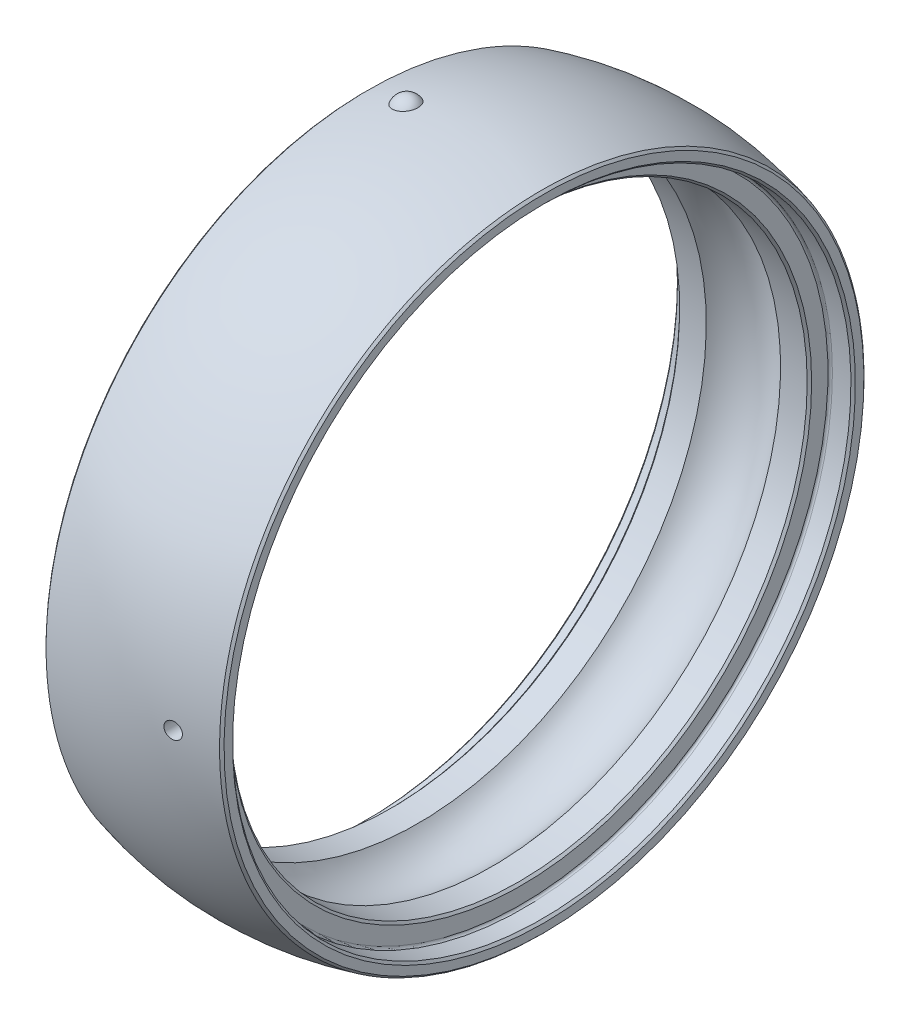
ISO-10303-21;
HEADER;
FILE_DESCRIPTION(('STEP AP214'),'2;1');
FILE_NAME('part.step','',(''),(''),'','','');
FILE_SCHEMA(('AUTOMOTIVE_DESIGN { 1 0 10303 214 1 1 1 1 }'));
ENDSEC;
DATA;
#1=APPLICATION_CONTEXT('core data for automotive mechanical design processes');
#2=APPLICATION_PROTOCOL_DEFINITION('international standard','automotive_design',2000,#1);
#3=PRODUCT_CONTEXT('',#1,'mechanical');
#4=PRODUCT('Part','Part','',(#3));
#5=PRODUCT_RELATED_PRODUCT_CATEGORY('part','',(#4));
#6=PRODUCT_DEFINITION_FORMATION('','',#4);
#7=PRODUCT_DEFINITION_CONTEXT('part definition',#1,'design');
#8=PRODUCT_DEFINITION('design','',#6,#7);
#9=PRODUCT_DEFINITION_SHAPE('','',#8);
#10=(LENGTH_UNIT() NAMED_UNIT(*) SI_UNIT(.MILLI.,.METRE.));
#11=(NAMED_UNIT(*) PLANE_ANGLE_UNIT() SI_UNIT($,.RADIAN.));
#12=(NAMED_UNIT(*) SI_UNIT($,.STERADIAN.) SOLID_ANGLE_UNIT());
#13=UNCERTAINTY_MEASURE_WITH_UNIT(LENGTH_MEASURE(1.E-05),#10,'distance_accuracy_value','');
#14=(GEOMETRIC_REPRESENTATION_CONTEXT(3) GLOBAL_UNCERTAINTY_ASSIGNED_CONTEXT((#13)) GLOBAL_UNIT_ASSIGNED_CONTEXT((#10,
#11,#12)) REPRESENTATION_CONTEXT('',''));
#15=CARTESIAN_POINT('',(0.,0.,0.));
#16=DIRECTION('',(0.,0.,1.));
#17=DIRECTION('',(1.,0.,0.));
#18=AXIS2_PLACEMENT_3D('',#15,#16,#17);
#19=CARTESIAN_POINT('',(-8.9,0.,40.3025));
#20=DIRECTION('',(-1.,0.,0.));
#21=DIRECTION('',(0.,0.,1.));
#22=AXIS2_PLACEMENT_3D('',#19,#20,#21);
#23=PLANE('',#22);
#24=CARTESIAN_POINT('',(-8.9,0.,0.));
#25=DIRECTION('',(-1.,0.,0.));
#26=DIRECTION('',(0.,0.,1.));
#27=AXIS2_PLACEMENT_3D('',#24,#25,#26);
#28=CIRCLE('',#27,39.2);
#29=CARTESIAN_POINT('',(-8.9,0.,39.2));
#30=VERTEX_POINT('',#29);
#31=EDGE_CURVE('E18',#30,#30,#28,.T.);
#32=ORIENTED_EDGE('',*,*,#31,.F.);
#33=EDGE_LOOP('',(#32));
#34=FACE_BOUND('',#33,.T.);
#35=CARTESIAN_POINT('',(-8.9,0.,0.));
#36=DIRECTION('',(1.,0.,0.));
#37=DIRECTION('',(0.,0.,1.));
#38=AXIS2_PLACEMENT_3D('',#35,#36,#37);
#39=CIRCLE('',#38,41.405);
#40=CARTESIAN_POINT('',(-8.9,0.,41.405));
#41=VERTEX_POINT('',#40);
#42=EDGE_CURVE('E157',#41,#41,#39,.T.);
#43=ORIENTED_EDGE('',*,*,#42,.F.);
#44=EDGE_LOOP('',(#43));
#45=FACE_BOUND('',#44,.T.);
#46=ADVANCED_FACE('F14',(#34,#45),#23,.T.);
#47=CARTESIAN_POINT('',(-8.6,0.,0.));
#48=DIRECTION('',(-1.,0.,0.));
#49=DIRECTION('',(0.,0.,1.));
#50=AXIS2_PLACEMENT_3D('',#47,#48,#49);
#51=CONICAL_SURFACE('',#50,38.9,0.785398163397443);
#52=ORIENTED_EDGE('',*,*,#31,.T.);
#53=EDGE_LOOP('',(#52));
#54=FACE_BOUND('',#53,.T.);
#55=CARTESIAN_POINT('',(-8.6,0.,0.));
#56=DIRECTION('',(-1.,0.,0.));
#57=DIRECTION('',(0.,0.,1.));
#58=AXIS2_PLACEMENT_3D('',#55,#56,#57);
#59=CIRCLE('',#58,38.8999999999693);
#60=CARTESIAN_POINT('',(-8.6,0.,38.8999999999693));
#61=VERTEX_POINT('',#60);
#62=EDGE_CURVE('E31',#61,#61,#59,.T.);
#63=ORIENTED_EDGE('',*,*,#62,.F.);
#64=EDGE_LOOP('',(#63));
#65=FACE_BOUND('',#64,.T.);
#66=ADVANCED_FACE('F180',(#54,#65),#51,.F.);
#67=CARTESIAN_POINT('',(-9.20000000000001,0.,0.));
#68=DIRECTION('',(1.,0.,0.));
#69=DIRECTION('',(0.,1.,0.));
#70=AXIS2_PLACEMENT_3D('',#67,#68,#69);
#71=TOROIDAL_SURFACE('',#70,41.405,0.300000000000004);
#72=ORIENTED_EDGE('',*,*,#42,.T.);
#73=EDGE_LOOP('',(#72));
#74=FACE_BOUND('',#73,.T.);
#75=CARTESIAN_POINT('',(-9.2,0.,0.));
#76=DIRECTION('',(-1.,0.,0.));
#77=DIRECTION('',(0.,0.,1.));
#78=AXIS2_PLACEMENT_3D('',#75,#76,#77);
#79=CIRCLE('',#78,41.705);
#80=CARTESIAN_POINT('',(-9.2,0.,41.705));
#81=VERTEX_POINT('',#80);
#82=EDGE_CURVE('E122',#81,#81,#79,.F.);
#83=ORIENTED_EDGE('',*,*,#82,.F.);
#84=EDGE_LOOP('',(#83));
#85=FACE_BOUND('',#84,.T.);
#86=ADVANCED_FACE('F170',(#74,#85),#71,.F.);
#87=CARTESIAN_POINT('',(-8.6,0.,0.));
#88=DIRECTION('',(1.,0.,0.));
#89=DIRECTION('',(0.,0.,-1.));
#90=AXIS2_PLACEMENT_3D('',#87,#88,#89);
#91=CYLINDRICAL_SURFACE('',#90,38.8999999999693);
#92=ORIENTED_EDGE('',*,*,#62,.T.);
#93=EDGE_LOOP('',(#92));
#94=FACE_BOUND('',#93,.T.);
#95=CARTESIAN_POINT('',(-5.01123737206781,0.,0.));
#96=DIRECTION('',(1.,0.,0.));
#97=DIRECTION('',(0.,1.,0.));
#98=AXIS2_PLACEMENT_3D('',#95,#96,#97);
#99=CIRCLE('',#98,38.8999999999386);
#100=CARTESIAN_POINT('',(-5.01123737206781,38.8999999999386,0.));
#101=VERTEX_POINT('',#100);
#102=EDGE_CURVE('E118',#101,#101,#99,.F.);
#103=ORIENTED_EDGE('',*,*,#102,.F.);
#104=EDGE_LOOP('',(#103));
#105=FACE_BOUND('',#104,.T.);
#106=ADVANCED_FACE('F179',(#94,#105),#91,.F.);
#107=CARTESIAN_POINT('',(8.9,0.,40.3025));
#108=DIRECTION('',(1.,0.,0.));
#109=DIRECTION('',(0.,0.,-1.));
#110=AXIS2_PLACEMENT_3D('',#107,#108,#109);
#111=PLANE('',#110);
#112=CARTESIAN_POINT('',(8.9,0.,0.));
#113=DIRECTION('',(-1.,0.,0.));
#114=DIRECTION('',(0.,0.,1.));
#115=AXIS2_PLACEMENT_3D('',#112,#113,#114);
#116=CIRCLE('',#115,41.405);
#117=CARTESIAN_POINT('',(8.9,0.,41.405));
#118=VERTEX_POINT('',#117);
#119=EDGE_CURVE('E185',#118,#118,#116,.T.);
#120=ORIENTED_EDGE('',*,*,#119,.F.);
#121=EDGE_LOOP('',(#120));
#122=FACE_BOUND('',#121,.T.);
#123=CARTESIAN_POINT('',(8.9,0.,0.));
#124=DIRECTION('',(1.,0.,0.));
#125=DIRECTION('',(0.,0.,-1.));
#126=AXIS2_PLACEMENT_3D('',#123,#124,#125);
#127=CIRCLE('',#126,39.2);
#128=CARTESIAN_POINT('',(8.9,0.,-39.2));
#129=VERTEX_POINT('',#128);
#130=EDGE_CURVE('E121',#129,#129,#127,.T.);
#131=ORIENTED_EDGE('',*,*,#130,.F.);
#132=EDGE_LOOP('',(#131));
#133=FACE_BOUND('',#132,.T.);
#134=ADVANCED_FACE('F137',(#122,#133),#111,.T.);
#135=CARTESIAN_POINT('',(9.2,0.,0.));
#136=DIRECTION('',(1.,0.,0.));
#137=DIRECTION('',(0.,1.,0.));
#138=AXIS2_PLACEMENT_3D('',#135,#136,#137);
#139=TOROIDAL_SURFACE('',#138,41.405,0.300000000000001);
#140=CARTESIAN_POINT('',(9.2,0.,0.));
#141=DIRECTION('',(-1.,0.,0.));
#142=DIRECTION('',(0.,0.,1.));
#143=AXIS2_PLACEMENT_3D('',#140,#141,#142);
#144=CIRCLE('',#143,41.705);
#145=CARTESIAN_POINT('',(9.2,0.,41.705));
#146=VERTEX_POINT('',#145);
#147=EDGE_CURVE('E126',#146,#146,#144,.T.);
#148=ORIENTED_EDGE('',*,*,#147,.F.);
#149=EDGE_LOOP('',(#148));
#150=FACE_BOUND('',#149,.T.);
#151=ORIENTED_EDGE('',*,*,#119,.T.);
#152=EDGE_LOOP('',(#151));
#153=FACE_BOUND('',#152,.T.);
#154=ADVANCED_FACE('F133',(#150,#153),#139,.F.);
#155=CARTESIAN_POINT('',(-11.7,0.,0.));
#156=DIRECTION('',(1.,0.,0.));
#157=DIRECTION('',(0.,0.,-1.));
#158=AXIS2_PLACEMENT_3D('',#155,#156,#157);
#159=CYLINDRICAL_SURFACE('',#158,41.705);
#160=CARTESIAN_POINT('',(-11.7,0.,0.));
#161=DIRECTION('',(-1.,0.,0.));
#162=DIRECTION('',(0.,0.,1.));
#163=AXIS2_PLACEMENT_3D('',#160,#161,#162);
#164=CIRCLE('',#163,41.705);
#165=CARTESIAN_POINT('',(-11.7,0.,41.705));
#166=VERTEX_POINT('',#165);
#167=EDGE_CURVE('E123',#166,#166,#164,.F.);
#168=ORIENTED_EDGE('',*,*,#167,.F.);
#169=EDGE_LOOP('',(#168));
#170=FACE_BOUND('',#169,.T.);
#171=ORIENTED_EDGE('',*,*,#82,.T.);
#172=EDGE_LOOP('',(#171));
#173=FACE_BOUND('',#172,.T.);
#174=ADVANCED_FACE('F110',(#170,#173),#159,.F.);
#175=CARTESIAN_POINT('',(6.3356431212469E-11,0.,0.));
#176=DIRECTION('',(1.,0.,0.));
#177=DIRECTION('',(0.,1.,0.));
#178=AXIS2_PLACEMENT_3D('',#175,#176,#177);
#179=TOROIDAL_SURFACE('',#178,34.9999999997076,6.35000000012959);
#180=CARTESIAN_POINT('',(5.01123737214672,0.,0.));
#181=DIRECTION('',(-1.,0.,0.));
#182=DIRECTION('',(0.,0.,1.));
#183=AXIS2_PLACEMENT_3D('',#180,#181,#182);
#184=CIRCLE('',#183,38.9);
#185=CARTESIAN_POINT('',(5.01123737214672,0.,38.9));
#186=VERTEX_POINT('',#185);
#187=EDGE_CURVE('E116',#186,#186,#184,.T.);
#188=ORIENTED_EDGE('',*,*,#187,.F.);
#189=EDGE_LOOP('',(#188));
#190=FACE_BOUND('',#189,.T.);
#191=ORIENTED_EDGE('',*,*,#102,.T.);
#192=EDGE_LOOP('',(#191));
#193=FACE_BOUND('',#192,.T.);
#194=ADVANCED_FACE('F105',(#190,#193),#179,.F.);
#195=CARTESIAN_POINT('',(8.6,0.,0.));
#196=DIRECTION('',(1.,0.,0.));
#197=DIRECTION('',(0.,0.,-1.));
#198=AXIS2_PLACEMENT_3D('',#195,#196,#197);
#199=CONICAL_SURFACE('',#198,38.9,0.785398163397443);
#200=CARTESIAN_POINT('',(8.6,0.,0.));
#201=DIRECTION('',(-1.,0.,0.));
#202=DIRECTION('',(0.,0.,1.));
#203=AXIS2_PLACEMENT_3D('',#200,#201,#202);
#204=CIRCLE('',#203,38.9);
#205=CARTESIAN_POINT('',(8.6,0.,38.9));
#206=VERTEX_POINT('',#205);
#207=EDGE_CURVE('E412',#206,#206,#204,.F.);
#208=ORIENTED_EDGE('',*,*,#207,.F.);
#209=EDGE_LOOP('',(#208));
#210=FACE_BOUND('',#209,.T.);
#211=ORIENTED_EDGE('',*,*,#130,.T.);
#212=EDGE_LOOP('',(#211));
#213=FACE_BOUND('',#212,.T.);
#214=ADVANCED_FACE('F101',(#210,#213),#199,.F.);
#215=CARTESIAN_POINT('',(9.2,0.,0.));
#216=DIRECTION('',(1.,0.,0.));
#217=DIRECTION('',(0.,0.,-1.));
#218=AXIS2_PLACEMENT_3D('',#215,#216,#217);
#219=CYLINDRICAL_SURFACE('',#218,41.705);
#220=ORIENTED_EDGE('',*,*,#147,.T.);
#221=EDGE_LOOP('',(#220));
#222=FACE_BOUND('',#221,.T.);
#223=CARTESIAN_POINT('',(11.7,0.,0.));
#224=DIRECTION('',(1.,0.,0.));
#225=DIRECTION('',(0.,0.,1.));
#226=AXIS2_PLACEMENT_3D('',#223,#224,#225);
#227=CIRCLE('',#226,41.705);
#228=CARTESIAN_POINT('',(11.7,0.,41.705));
#229=VERTEX_POINT('',#228);
#230=EDGE_CURVE('E410',#229,#229,#227,.F.);
#231=ORIENTED_EDGE('',*,*,#230,.F.);
#232=EDGE_LOOP('',(#231));
#233=FACE_BOUND('',#232,.T.);
#234=ADVANCED_FACE('F97',(#222,#233),#219,.F.);
#235=CARTESIAN_POINT('',(-11.7,0.,0.));
#236=DIRECTION('',(-1.,0.,0.));
#237=DIRECTION('',(0.,0.,1.));
#238=AXIS2_PLACEMENT_3D('',#235,#236,#237);
#239=CONICAL_SURFACE('',#238,41.705,0.785398163397443);
#240=CARTESIAN_POINT('',(-12.,0.,0.));
#241=DIRECTION('',(-1.,0.,0.));
#242=DIRECTION('',(0.,0.,1.));
#243=AXIS2_PLACEMENT_3D('',#240,#241,#242);
#244=CIRCLE('',#243,42.005);
#245=CARTESIAN_POINT('',(-12.,0.,42.005));
#246=VERTEX_POINT('',#245);
#247=EDGE_CURVE('E87',#246,#246,#244,.F.);
#248=ORIENTED_EDGE('',*,*,#247,.F.);
#249=EDGE_LOOP('',(#248));
#250=FACE_BOUND('',#249,.T.);
#251=ORIENTED_EDGE('',*,*,#167,.T.);
#252=EDGE_LOOP('',(#251));
#253=FACE_BOUND('',#252,.T.);
#254=ADVANCED_FACE('F93',(#250,#253),#239,.F.);
#255=CARTESIAN_POINT('',(5.01123737214672,0.,0.));
#256=DIRECTION('',(1.,0.,0.));
#257=DIRECTION('',(0.,0.,-1.));
#258=AXIS2_PLACEMENT_3D('',#255,#256,#257);
#259=CYLINDRICAL_SURFACE('',#258,38.9);
#260=ORIENTED_EDGE('',*,*,#187,.T.);
#261=EDGE_LOOP('',(#260));
#262=FACE_BOUND('',#261,.T.);
#263=ORIENTED_EDGE('',*,*,#207,.T.);
#264=EDGE_LOOP('',(#263));
#265=FACE_BOUND('',#264,.T.);
#266=CARTESIAN_POINT('',(7.59090909090909,0.,38.9));
#267=CARTESIAN_POINT('',(7.59090647923076,0.0612688742239235,38.8999998009549));
#268=CARTESIAN_POINT('',(7.58573056288146,0.122578275298999,38.899853707613));
#269=CARTESIAN_POINT('',(7.56515636097532,0.243503726706698,38.8992850022121));
#270=CARTESIAN_POINT('',(7.54974681030102,0.3031178353749,38.8988620854351));
#271=CARTESIAN_POINT('',(7.50914519893063,0.418889280249427,38.8977876221528));
#272=CARTESIAN_POINT('',(7.48395755144025,0.475048162695174,38.8971361788027));
#273=CARTESIAN_POINT('',(7.42452097052474,0.582326089704839,38.8956781403145));
#274=CARTESIAN_POINT('',(7.39027406857527,0.633446260642028,38.8948715799714));
#275=CARTESIAN_POINT('',(7.31367483163809,0.729230782637599,38.8931937724903));
#276=CARTESIAN_POINT('',(7.27131973309968,0.773892923441763,38.8923225033594));
#277=CARTESIAN_POINT('',(7.17971117306092,0.85547501778227,38.8906136723663));
#278=CARTESIAN_POINT('',(7.13045745900026,0.892394687740897,38.8897761117397));
#279=CARTESIAN_POINT('',(7.02644179676412,0.95744711376481,38.8882290395282));
#280=CARTESIAN_POINT('',(6.97167903252646,0.985578565479542,38.8875195469579));
#281=CARTESIAN_POINT('',(6.85820568013595,1.03224747811336,38.8863088149152));
#282=CARTESIAN_POINT('',(6.79949511074948,1.05078498463484,38.8858075744529));
#283=CARTESIAN_POINT('',(6.67980912296523,1.0777351656857,38.8850700210112));
#284=CARTESIAN_POINT('',(6.61883430866011,1.08615052104533,38.884833637886));
#285=CARTESIAN_POINT('',(6.49633693144018,1.09262577861607,38.8846522408464));
#286=CARTESIAN_POINT('',(6.43481436973422,1.09068570367575,38.8847072262892));
#287=CARTESIAN_POINT('',(6.31298649100604,1.07650745176033,38.8851023004651));
#288=CARTESIAN_POINT('',(6.25268083003901,1.06427222756488,38.8854423074504));
#289=CARTESIAN_POINT('',(6.13497924010944,1.02985536855297,38.8863689715429));
#290=CARTESIAN_POINT('',(6.07758334391107,1.00767362176558,38.8869556314268));
#291=CARTESIAN_POINT('',(5.96731974136376,0.95398905620133,38.8883095853284));
#292=CARTESIAN_POINT('',(5.91445285490904,0.922484554289225,38.8890769119588));
#293=CARTESIAN_POINT('',(5.81476193254729,0.851053018509885,38.8907055799288));
#294=CARTESIAN_POINT('',(5.76793739321325,0.811126687050917,38.8915669134252));
#295=CARTESIAN_POINT('',(5.68164639199666,0.723975960850136,38.8932867526915));
#296=CARTESIAN_POINT('',(5.64218104275179,0.676750464516633,38.8941452580147));
#297=CARTESIAN_POINT('',(5.57171993564294,0.576318114447538,38.8957629507746));
#298=CARTESIAN_POINT('',(5.54072818849533,0.523108445047515,38.8965220910917));
#299=CARTESIAN_POINT('',(5.48809701300902,0.412199257742285,38.8978555945934));
#300=CARTESIAN_POINT('',(5.46646547298952,0.35449600099435,38.8984298018217));
#301=CARTESIAN_POINT('',(5.4332468438259,0.236369693800255,38.899326449904));
#302=CARTESIAN_POINT('',(5.4216383778918,0.175952722225756,38.8996494264256));
#303=CARTESIAN_POINT('',(5.41111851280162,0.0768328639234073,38.89994309158));
#304=CARTESIAN_POINT('',(5.40908775168116,0.0384273141913161,38.9000002049014));
#305=CARTESIAN_POINT('',(5.40909593997462,-0.0612284638411547,38.8999996735188));
#306=CARTESIAN_POINT('',(5.41426466152305,-0.122512183059181,38.8998538281452));
#307=CARTESIAN_POINT('',(5.43482700301429,-0.243444035274018,38.8992854737307));
#308=CARTESIAN_POINT('',(5.45024249057527,-0.303088385600007,38.8988623730268));
#309=CARTESIAN_POINT('',(5.49085782830395,-0.418896855273684,38.8977875375903));
#310=CARTESIAN_POINT('',(5.51604956447789,-0.475063816041468,38.8971359925028));
#311=CARTESIAN_POINT('',(5.57548865232926,-0.582340648092586,38.8956779159489));
#312=CARTESIAN_POINT('',(5.609731428369,-0.633453056749687,38.8948714628503));
#313=CARTESIAN_POINT('',(5.68631977601548,-0.729224117352391,38.8931938873192));
#314=CARTESIAN_POINT('',(5.72866813274078,-0.773880541704289,38.8923227427214));
#315=CARTESIAN_POINT('',(5.82027567070568,-0.855464876867138,38.8906139047967));
#316=CARTESIAN_POINT('',(5.86953700233241,-0.892390373913808,38.8897762219831));
#317=CARTESIAN_POINT('',(5.97358540845301,-0.957464978546994,38.8882286070125));
#318=CARTESIAN_POINT('',(6.02837558884134,-0.985609116370725,38.8875187472921));
#319=CARTESIAN_POINT('',(6.14186589633645,-1.03226882807411,38.8863082680777));
#320=CARTESIAN_POINT('',(6.20056160638387,-1.05079507755132,38.8858074167118));
#321=CARTESIAN_POINT('',(6.29965169403779,-1.07311203439291,38.8851964657298));
#322=CARTESIAN_POINT('',(6.33942200917387,-1.07977706143556,38.8850112716924));
#323=CARTESIAN_POINT('',(6.41945571048958,-1.08867644842757,38.8847631228662));
#324=CARTESIAN_POINT('',(6.45971909675072,-1.09091080764453,38.8847001680977));
#325=CARTESIAN_POINT('',(6.56126881953424,-1.09090647968777,38.8847004985069));
#326=CARTESIAN_POINT('',(6.62257816565829,-1.08573057428088,38.8848466506588));
#327=CARTESIAN_POINT('',(6.74350360862982,-1.06515638833712,38.8854155663158));
#328=CARTESIAN_POINT('',(6.80311776097444,-1.04974682620074,38.8858386350869));
#329=CARTESIAN_POINT('',(6.91889024933348,-1.0091448692557,38.8869134377846));
#330=CARTESIAN_POINT('',(6.97505007467491,-0.983956725203713,38.8875650723417));
#331=CARTESIAN_POINT('',(7.08232782723967,-0.924519774791916,38.8890234196507));
#332=CARTESIAN_POINT('',(7.13344705601666,-0.890273315872659,38.8898300922103));
#333=CARTESIAN_POINT('',(7.22922531664272,-0.81367931948145,38.8915079357158));
#334=CARTESIAN_POINT('',(7.27388275256823,-0.771329786702212,38.8923791225155));
#335=CARTESIAN_POINT('',(7.35546668784409,-0.679721893815124,38.894087881834));
#336=CARTESIAN_POINT('',(7.39239116152192,-0.630461729075573,38.8949254454989));
#337=CARTESIAN_POINT('',(7.45746483125912,-0.526414836331905,38.8964727718558));
#338=CARTESIAN_POINT('',(7.4856088738816,-0.471624887642122,38.8971824593917));
#339=CARTESIAN_POINT('',(7.53226866485681,-0.358134613736469,38.8983926024284));
#340=CARTESIAN_POINT('',(7.55079501180285,-0.299438673728499,38.8988932881272));
#341=CARTESIAN_POINT('',(7.57311203569411,-0.200348307965899,38.899504023763));
#342=CARTESIAN_POINT('',(7.57977706866542,-0.160577952117944,38.8996891479208));
#343=CARTESIAN_POINT('',(7.58867645144832,-0.0805442360330944,38.8999372013776));
#344=CARTESIAN_POINT('',(7.59091080794232,-0.040280876539847,38.9000001308611));
#345=CARTESIAN_POINT('',(7.59090909090909,0.,38.9));
#346=B_SPLINE_CURVE_WITH_KNOTS('',3,(#266,#267,#268,#269,#270,#271,#272,#273,#274,#275,#276,
#277,#278,#279,#280,#281,#282,#283,#284,#285,#286,#287,#288,#289,#290,#291,#292,#293,#294,#295,
#296,#297,#298,#299,#300,#301,#302,#303,#304,#305,#306,#307,#308,#309,#310,#311,#312,#313,#314,
#315,#316,#317,#318,#319,#320,#321,#322,#323,#324,#325,#326,#327,#328,#329,#330,#331,#332,#333,
#334,#335,#336,#337,#338,#339,#340,#341,#342,#343,#344,#345),.UNSPECIFIED.,.T.,.F.,(4,2,2,2,2,2,
2,2,2,2,2,2,2,2,2,2,2,2,2,2,2,2,2,2,2,2,2,2,2,2,2,2,2,2,2,2,2,2,2,4),(0.,0.183660035649089,
0.367522578912492,0.551302234714609,0.735040714073538,0.91884192964873,1.1026498759989,
1.28648509024452,1.47031943066791,1.65410507222799,1.83789030827707,2.02162285034485,
2.20535746079589,2.389125263052,2.57287774452527,2.7566579850944,2.94052506233637,
3.1245467932812,3.30817507406544,3.42338132308234,3.60694610768031,3.79090390094676,
3.97470934016386,4.15842203601914,4.3421979701775,4.52603119790766,4.70996827713528,
4.89370075226418,5.01444706916866,5.13519340603284,5.31885327773353,5.50271595320536,
5.68649879277122,5.87023405203861,6.05401461278206,6.23784325534094,6.42177958905832,
6.60551279440258,6.72625923332086,6.84700549012734),.UNSPECIFIED.);
#347=CARTESIAN_POINT('',(7.59090909090909,0.,38.9));
#348=VERTEX_POINT('',#347);
#349=EDGE_CURVE('E80',#348,#348,#346,.T.);
#350=ORIENTED_EDGE('',*,*,#349,.T.);
#351=EDGE_LOOP('',(#350));
#352=FACE_BOUND('',#351,.T.);
#353=ADVANCED_FACE('F88',(#262,#265,#352),#259,.F.);
#354=CARTESIAN_POINT('',(11.7,0.,0.));
#355=DIRECTION('',(1.,0.,0.));
#356=DIRECTION('',(0.,1.,0.));
#357=AXIS2_PLACEMENT_3D('',#354,#355,#356);
#358=CONICAL_SURFACE('',#357,41.705,0.785398163397443);
#359=ORIENTED_EDGE('',*,*,#230,.T.);
#360=EDGE_LOOP('',(#359));
#361=FACE_BOUND('',#360,.T.);
#362=CARTESIAN_POINT('',(12.,0.,0.));
#363=DIRECTION('',(1.,0.,0.));
#364=DIRECTION('',(0.,1.,0.));
#365=AXIS2_PLACEMENT_3D('',#362,#363,#364);
#366=CIRCLE('',#365,42.005);
#367=CARTESIAN_POINT('',(12.,42.005,0.));
#368=VERTEX_POINT('',#367);
#369=EDGE_CURVE('E86',#368,#368,#366,.F.);
#370=ORIENTED_EDGE('',*,*,#369,.F.);
#371=EDGE_LOOP('',(#370));
#372=FACE_BOUND('',#371,.T.);
#373=ADVANCED_FACE('F92',(#361,#372),#358,.F.);
#374=CARTESIAN_POINT('',(-12.,0.,42.578693868232));
#375=DIRECTION('',(-1.,0.,0.));
#376=DIRECTION('',(0.,0.,1.));
#377=AXIS2_PLACEMENT_3D('',#374,#375,#376);
#378=PLANE('',#377);
#379=ORIENTED_EDGE('',*,*,#247,.T.);
#380=EDGE_LOOP('',(#379));
#381=FACE_BOUND('',#380,.T.);
#382=CARTESIAN_POINT('',(-12.,0.,0.));
#383=DIRECTION('',(1.,0.,0.));
#384=DIRECTION('',(0.,0.,-1.));
#385=AXIS2_PLACEMENT_3D('',#382,#383,#384);
#386=CIRCLE('',#385,43.1523877364639);
#387=CARTESIAN_POINT('',(-12.,0.,-43.1523877364639));
#388=VERTEX_POINT('',#387);
#389=EDGE_CURVE('E67',#388,#388,#386,.T.);
#390=ORIENTED_EDGE('',*,*,#389,.F.);
#391=EDGE_LOOP('',(#390));
#392=FACE_BOUND('',#391,.T.);
#393=ADVANCED_FACE('F75',(#381,#392),#378,.T.);
#394=CARTESIAN_POINT('',(6.5,0.,45.));
#395=DIRECTION('',(0.,0.,1.));
#396=DIRECTION('',(1.,0.,0.));
#397=AXIS2_PLACEMENT_3D('',#394,#395,#396);
#398=CYLINDRICAL_SURFACE('',#397,1.09090909090909);
#399=CARTESIAN_POINT('',(5.4090909090909,0.,44.673725334747));
#400=CARTESIAN_POINT('',(5.40909866648048,0.0607723013507395,44.6737242099249));
#401=CARTESIAN_POINT('',(5.41419635152178,0.121625812549642,44.6729825172391));
#402=CARTESIAN_POINT('',(5.42936666500421,0.211566000573845,44.6707751317815));
#403=CARTESIAN_POINT('',(5.43569061250214,0.241360789582284,44.6698549397112));
#404=CARTESIAN_POINT('',(5.45080595664176,0.300334535465628,44.6676554219226));
#405=CARTESIAN_POINT('',(5.45959941623327,0.329512955439855,44.6663757959449));
#406=CARTESIAN_POINT('',(5.48955333820313,0.415651119208168,44.6620166614546));
#407=CARTESIAN_POINT('',(5.51431456937918,0.471373858408431,44.6584129357403));
#408=CARTESIAN_POINT('',(5.57271382424974,0.577849764937127,44.6499121534928));
#409=CARTESIAN_POINT('',(5.60635258280338,0.628602520385884,44.645014989892));
#410=CARTESIAN_POINT('',(5.6627739524805,0.700046918290153,44.6367994289344));
#411=CARTESIAN_POINT('',(5.68264157753481,0.723141268707484,44.6339062343743));
#412=CARTESIAN_POINT('',(5.72419542932606,0.767550602980925,44.6278543702456));
#413=CARTESIAN_POINT('',(5.74587987871752,0.788867286057042,44.624695960123));
#414=CARTESIAN_POINT('',(5.81348298929251,0.849977191229323,44.6148482144139));
#415=CARTESIAN_POINT('',(5.86196135408289,0.886942821308094,44.6077849161071));
#416=CARTESIAN_POINT('',(5.96477752580942,0.952565094799659,44.5928006063121));
#417=CARTESIAN_POINT('',(6.01916824473331,0.981136492456677,44.5848718463029));
#418=CARTESIAN_POINT('',(6.13189799701096,1.02874958701631,44.5684340157614));
#419=CARTESIAN_POINT('',(6.19023720315621,1.04779086656074,44.5599249198325));
#420=CARTESIAN_POINT('',(6.309788290384,1.07596910303527,44.5424824864309));
#421=CARTESIAN_POINT('',(6.37102198093767,1.08501150100869,44.5335459187283));
#422=CARTESIAN_POINT('',(6.49412375734743,1.09263514310818,44.5155746790053));
#423=CARTESIAN_POINT('',(6.5559918658436,1.09121601259359,44.5065400034832));
#424=CARTESIAN_POINT('',(6.6789231559633,1.07791874351638,44.4885827721848));
#425=CARTESIAN_POINT('',(6.73998100544213,1.06599011335904,44.4796609688628));
#426=CARTESIAN_POINT('',(6.85923651886637,1.03193003219581,44.462230245542));
#427=CARTESIAN_POINT('',(6.91743415136296,1.00979846903377,44.4537213300829));
#428=CARTESIAN_POINT('',(7.02922091719481,0.955951971195176,44.4373729181172));
#429=CARTESIAN_POINT('',(7.08281836976215,0.924254825419191,44.4295322133687));
#430=CARTESIAN_POINT('',(7.15859292415099,0.870232127639043,44.4184446246744));
#431=CARTESIAN_POINT('',(7.18308400900482,0.851141872711522,44.4148605422866));
#432=CARTESIAN_POINT('',(7.23039634199519,0.810906224172334,44.4079359645945));
#433=CARTESIAN_POINT('',(7.25321589530966,0.789758793932235,44.4045957165334));
#434=CARTESIAN_POINT('',(7.31848902276677,0.723846795247733,44.3950402648922));
#435=CARTESIAN_POINT('',(7.35822752852448,0.676276224430987,44.3892215072226));
#436=CARTESIAN_POINT('',(7.4291249659771,0.57500377582388,44.3788386475817));
#437=CARTESIAN_POINT('',(7.4602848796563,0.521302600795052,44.3742744020074));
#438=CARTESIAN_POINT('',(7.49975912955687,0.437616075494003,44.3684916585394));
#439=CARTESIAN_POINT('',(7.51167271720385,0.409318207444471,44.3667462663448));
#440=CARTESIAN_POINT('',(7.53307226154359,0.351831284641707,44.363610990822));
#441=CARTESIAN_POINT('',(7.54256029374833,0.322643015895328,44.3622208035508));
#442=CARTESIAN_POINT('',(7.56724537159726,0.234107385566588,44.3586038257391));
#443=CARTESIAN_POINT('',(7.57873445106567,0.173638339836565,44.3569202092048));
#444=CARTESIAN_POINT('',(7.58896535088611,0.0752645028636467,44.3554209501261));
#445=CARTESIAN_POINT('',(7.59091389910399,0.0376478483485556,44.355135398304));
#446=CARTESIAN_POINT('',(7.59090133011883,-0.0607664760958709,44.3551372466233));
#447=CARTESIAN_POINT('',(7.58580460653524,-0.121614219622942,44.3558841610573));
#448=CARTESIAN_POINT('',(7.57063725313537,-0.211545747578848,44.3581067364118));
#449=CARTESIAN_POINT('',(7.56431454362569,-0.241337657080597,44.3590332316999));
#450=CARTESIAN_POINT('',(7.54920221727234,-0.300305656199202,44.3612476101045));
#451=CARTESIAN_POINT('',(7.54041053913972,-0.329481209255004,44.3625357951881));
#452=CARTESIAN_POINT('',(7.51046290421115,-0.415610613473251,44.3669235808161));
#453=CARTESIAN_POINT('',(7.48570707923672,-0.471327561069871,44.3705504083395));
#454=CARTESIAN_POINT('',(7.42732114731368,-0.577792824296887,44.37910274369));
#455=CARTESIAN_POINT('',(7.39369029666249,-0.628540723045905,44.3840283603519));
#456=CARTESIAN_POINT('',(7.33728092560902,-0.699981200365378,44.3922884372508));
#457=CARTESIAN_POINT('',(7.31741638555738,-0.723075664783656,44.3951969624138));
#458=CARTESIAN_POINT('',(7.27586890434525,-0.767485492635542,44.4012796055891));
#459=CARTESIAN_POINT('',(7.2541877405098,-0.788802555197008,44.4044534640012));
#460=CARTESIAN_POINT('',(7.18659468068031,-0.84991415747782,44.4143471145102));
#461=CARTESIAN_POINT('',(7.13812331383045,-0.886881616923516,44.4214404320854));
#462=CARTESIAN_POINT('',(7.03531440654311,-0.952513652229206,44.4364814865639));
#463=CARTESIAN_POINT('',(6.98092325946299,-0.98109188628783,44.4444370280677));
#464=CARTESIAN_POINT('',(6.86819056516411,-1.02871812741788,44.4609211287248));
#465=CARTESIAN_POINT('',(6.80984884396143,-1.04776571444772,44.4694497131149));
#466=CARTESIAN_POINT('',(6.69028891209954,-1.0759558167656,44.4869221034719));
#467=CARTESIAN_POINT('',(6.62904881552623,-1.08500352987108,44.4958690592205));
#468=CARTESIAN_POINT('',(6.50593190200896,-1.09263527958035,44.513850464944));
#469=CARTESIAN_POINT('',(6.44405506268407,-1.0912189471192,44.5228849179938));
#470=CARTESIAN_POINT('',(6.32111109326029,-1.07792459810084,44.5408301873535));
#471=CARTESIAN_POINT('',(6.26004917310906,-1.06599716198388,44.5497402173854));
#472=CARTESIAN_POINT('',(6.14078454180101,-1.03193761807259,44.5671380483727));
#473=CARTESIAN_POINT('',(6.08258185953732,-1.00980540718051,44.5756258450612));
#474=CARTESIAN_POINT('',(5.97079263320908,-0.955959269623264,44.591923922805));
#475=CARTESIAN_POINT('',(5.9171971654605,-0.924264427778332,44.5997355138141));
#476=CARTESIAN_POINT('',(5.84142505625431,-0.870245684995218,44.610776781381));
#477=CARTESIAN_POINT('',(5.81693469886526,-0.851156832838899,44.6143449790319));
#478=CARTESIAN_POINT('',(5.76962368169873,-0.810924202328562,44.6212373327415));
#479=CARTESIAN_POINT('',(5.74680471585856,-0.789778388431323,44.6245612412269));
#480=CARTESIAN_POINT('',(5.68153475298212,-0.723873211478644,44.6340677646062));
#481=CARTESIAN_POINT('',(5.64179835481854,-0.676308491208234,44.6398539979616));
#482=CARTESIAN_POINT('',(5.57090365431412,-0.575049359479105,44.6501757716058));
#483=CARTESIAN_POINT('',(5.53974437912283,-0.521355644172839,44.654711453737));
#484=CARTESIAN_POINT('',(5.5002682552733,-0.437678590616535,44.6604571558333));
#485=CARTESIAN_POINT('',(5.48835316930674,-0.409382123427289,44.6621912622711));
#486=CARTESIAN_POINT('',(5.46695052225454,-0.351898103345614,44.6653060296193));
#487=CARTESIAN_POINT('',(5.45746088536651,-0.322711336521643,44.6666869927653));
#488=CARTESIAN_POINT('',(5.43277071686752,-0.234180231461175,44.6702798714613));
#489=CARTESIAN_POINT('',(5.42127791918258,-0.173714345525043,44.6719521102438));
#490=CARTESIAN_POINT('',(5.41103738693709,-0.0753173474333115,44.6734421237952));
#491=CARTESIAN_POINT('',(5.40908610008995,-0.0376742784813681,44.6737260320524));
#492=CARTESIAN_POINT('',(5.4090909090909,0.,44.673725334747));
#493=B_SPLINE_CURVE_WITH_KNOTS('',3,(#399,#400,#401,#402,#403,#404,#405,#406,#407,#408,#409,
#410,#411,#412,#413,#414,#415,#416,#417,#418,#419,#420,#421,#422,#423,#424,#425,#426,#427,#428,
#429,#430,#431,#432,#433,#434,#435,#436,#437,#438,#439,#440,#441,#442,#443,#444,#445,#446,#447,
#448,#449,#450,#451,#452,#453,#454,#455,#456,#457,#458,#459,#460,#461,#462,#463,#464,#465,#466,
#467,#468,#469,#470,#471,#472,#473,#474,#475,#476,#477,#478,#479,#480,#481,#482,#483,#484,#485,
#486,#487,#488,#489,#490,#491,#492),.UNSPECIFIED.,.T.,.F.,(4,2,2,2,2,2,2,2,2,2,2,2,2,2,2,2,2,2,
2,2,2,2,2,2,2,2,2,2,2,2,2,2,2,2,2,2,2,2,2,2,2,2,2,2,2,2,4),(0.,0.182183050978209,
0.273513700302245,0.364920872383004,0.547254198467521,0.729602622377586,0.821312452144544,
0.912933589634151,1.09612823584793,1.28112361383817,1.46612709273318,1.65286556306351,
1.83961072076903,2.02725799511807,2.21490733223689,2.40220983031284,2.49588786843974,
2.58965961154319,2.77547882928058,2.96127676759473,3.05343681994223,3.14551774632324,
3.3291845500581,3.44204522950934,3.62421090645701,3.71553292403229,3.80693141222884,
3.98924658880873,4.1715770477496,4.26328550773732,4.35490526805873,4.53809733837356,
4.7231135528017,4.90813792068041,5.09490172427855,5.28167211503266,5.46932534844322,
5.65698047773581,5.84426354032247,5.93793184936979,6.03169381306553,6.21748673474171,
6.40325857437472,6.49541461279833,6.58749151405424,6.7711506489447,6.88409050550083),.UNSPECIFIED.);
#494=CARTESIAN_POINT('',(5.4090909090909,0.,44.673725334747));
#495=VERTEX_POINT('',#494);
#496=EDGE_CURVE('E59',#495,#495,#493,.T.);
#497=ORIENTED_EDGE('',*,*,#496,.F.);
#498=EDGE_LOOP('',(#497));
#499=FACE_BOUND('',#498,.T.);
#500=ORIENTED_EDGE('',*,*,#349,.F.);
#501=EDGE_LOOP('',(#500));
#502=FACE_BOUND('',#501,.T.);
#503=ADVANCED_FACE('F69',(#499,#502),#398,.F.);
#504=CARTESIAN_POINT('',(12.,0.,42.578693868232));
#505=DIRECTION('',(1.,0.,0.));
#506=DIRECTION('',(0.,0.,-1.));
#507=AXIS2_PLACEMENT_3D('',#504,#505,#506);
#508=PLANE('',#507);
#509=CARTESIAN_POINT('',(12.,0.,0.));
#510=DIRECTION('',(-1.,0.,0.));
#511=DIRECTION('',(0.,-1.,0.));
#512=AXIS2_PLACEMENT_3D('',#509,#510,#511);
#513=CIRCLE('',#512,43.1523877364639);
#514=CARTESIAN_POINT('',(12.,-43.1523877364639,0.));
#515=VERTEX_POINT('',#514);
#516=EDGE_CURVE('E66',#515,#515,#513,.T.);
#517=ORIENTED_EDGE('',*,*,#516,.F.);
#518=EDGE_LOOP('',(#517));
#519=FACE_BOUND('',#518,.T.);
#520=ORIENTED_EDGE('',*,*,#369,.T.);
#521=EDGE_LOOP('',(#520));
#522=FACE_BOUND('',#521,.T.);
#523=ADVANCED_FACE('F74',(#519,#522),#508,.T.);
#524=CARTESIAN_POINT('',(-11.7,0.,0.));
#525=DIRECTION('',(1.,0.,0.));
#526=DIRECTION('',(0.,0.,-1.));
#527=AXIS2_PLACEMENT_3D('',#524,#525,#526);
#528=CONICAL_SURFACE('',#527,43.4523877364639,0.785398163397443);
#529=CARTESIAN_POINT('',(-11.7,0.,0.));
#530=DIRECTION('',(1.,0.,0.));
#531=DIRECTION('',(0.,0.,-1.));
#532=AXIS2_PLACEMENT_3D('',#529,#530,#531);
#533=CIRCLE('',#532,43.4523877364639);
#534=CARTESIAN_POINT('',(-11.7,0.,-43.4523877364639));
#535=VERTEX_POINT('',#534);
#536=EDGE_CURVE('E27',#535,#535,#533,.T.);
#537=ORIENTED_EDGE('',*,*,#536,.F.);
#538=EDGE_LOOP('',(#537));
#539=FACE_BOUND('',#538,.T.);
#540=ORIENTED_EDGE('',*,*,#389,.T.);
#541=EDGE_LOOP('',(#540));
#542=FACE_BOUND('',#541,.T.);
#543=ADVANCED_FACE('F273',(#539,#542),#528,.T.);
#544=CARTESIAN_POINT('',(-6.5,43.65,0.));
#545=DIRECTION('',(0.710422157002014,0.193472860094203,0.676659893334588));
#546=DIRECTION('',(0.17392685144859,0.883382049621728,-0.43518456400853));
#547=AXIS2_PLACEMENT_3D('',#544,#545,#546);
#548=SPHERICAL_SURFACE('',#547,1.84615384615385);
#549=CARTESIAN_POINT('',(-8.2502678326488,44.2372363558768,0.));
#550=CARTESIAN_POINT('',(-8.2502626628644,44.2372371257187,-0.0923139660950142));
#551=CARTESIAN_POINT('',(-8.24253810627397,44.2383874033326,-0.184792224566257));
#552=CARTESIAN_POINT('',(-8.21955273540498,44.2418101962461,-0.321462157862114));
#553=CARTESIAN_POINT('',(-8.20997113619522,44.2432370094162,-0.366735507154362));
#554=CARTESIAN_POINT('',(-8.18706276100314,44.246648336765,-0.456349941989301));
#555=CARTESIAN_POINT('',(-8.17373294526324,44.2486333035995,-0.500690239336915));
#556=CARTESIAN_POINT('',(-8.12830454670518,44.2553981281282,-0.631612092730698));
#557=CARTESIAN_POINT('',(-8.09072969783266,44.2609934664493,-0.716314989959801));
#558=CARTESIAN_POINT('',(-8.00202977771732,44.2742019310736,-0.878133896326073));
#559=CARTESIAN_POINT('',(-7.95090420577197,44.2818151319373,-0.95524962497111));
#560=CARTESIAN_POINT('',(-7.86521279111664,44.294575594603,-1.06355378377276));
#561=CARTESIAN_POINT('',(-7.83512782601918,44.2990556008612,-1.09844555291345));
#562=CARTESIAN_POINT('',(-7.77219179519748,44.3084275183964,-1.16551301142591));
#563=CARTESIAN_POINT('',(-7.73934341333129,44.3133190300153,-1.19769127671134));
#564=CARTESIAN_POINT('',(-7.63689911392402,44.3285741948782,-1.2898879029629));
#565=CARTESIAN_POINT('',(-7.56339841220128,44.339519316557,-1.34557519680343));
#566=CARTESIAN_POINT('',(-7.40820696057629,44.3626291547183,-1.44366986713909));
#567=CARTESIAN_POINT('',(-7.32651294360272,44.3747943577062,-1.48607191814905));
#568=CARTESIAN_POINT('',(-7.15729257334665,44.3999932673707,-1.55637097930525));
#569=CARTESIAN_POINT('',(-7.06977280453914,44.4130259935413,-1.58428406158995));
#570=CARTESIAN_POINT('',(-6.92206106635608,44.4350220141223,-1.6178940126151));
#571=CARTESIAN_POINT('',(-6.86279795355546,44.4438469908295,-1.62792762786453));
#572=CARTESIAN_POINT('',(-6.74353829721407,44.4616061607346,-1.64132498149588));
#573=CARTESIAN_POINT('',(-6.6835417533012,44.4705403539877,-1.64468871649364));
#574=CARTESIAN_POINT('',(-6.5321360705322,44.4930864465002,-1.64468228020967));
#575=CARTESIAN_POINT('',(-6.44069255412431,44.5067034649826,-1.63687556078363));
#576=CARTESIAN_POINT('',(-6.26033006485504,44.5335615676277,-1.60584340111689));
#577=CARTESIAN_POINT('',(-6.17141399546538,44.5468022194291,-1.58260092031651));
#578=CARTESIAN_POINT('',(-5.99873482686787,44.5725161849751,-1.52135843275176));
#579=CARTESIAN_POINT('',(-5.91496957105685,44.5849898198632,-1.48336465164569));
#580=CARTESIAN_POINT('',(-5.75496141205899,44.6088169225818,-1.39370825797076));
#581=CARTESIAN_POINT('',(-5.67871654731434,44.6201706825114,-1.34204922274844));
#582=CARTESIAN_POINT('',(-5.53588524023444,44.6414399493197,-1.22652490441582));
#583=CARTESIAN_POINT('',(-5.46929879947925,44.6513554559631,-1.16265961930865));
#584=CARTESIAN_POINT('',(-5.34765859918153,44.6694691169499,-1.02451416000112));
#585=CARTESIAN_POINT('',(-5.29260785728953,44.6776668219295,-0.950231269096711));
#586=CARTESIAN_POINT('',(-5.19560468199245,44.6921117392157,-0.793350263034834));
#587=CARTESIAN_POINT('',(-5.15365777848892,44.6983581280547,-0.710748656719864));
#588=CARTESIAN_POINT('',(-5.08411996427427,44.7087131290277,-0.539657294656575));
#589=CARTESIAN_POINT('',(-5.05651326121763,44.7128240928284,-0.451174137741457));
#590=CARTESIAN_POINT('',(-5.02327073351045,44.7177742974134,-0.301834147597598));
#591=CARTESIAN_POINT('',(-5.01334626685403,44.7192521675916,-0.241917251003877));
#592=CARTESIAN_POINT('',(-5.00009483412979,44.7212254622702,-0.121342371639846));
#593=CARTESIAN_POINT('',(-4.99676786035233,44.7217208879187,-0.0606843897356298));
#594=CARTESIAN_POINT('',(-4.99677431027636,44.7217199274489,0.0923907234295497));
#595=CARTESIAN_POINT('',(-5.00449586582842,44.7205700967251,0.184842658707838));
#596=CARTESIAN_POINT('',(-5.03518957078435,44.7159994419198,0.367193949106213));
#597=CARTESIAN_POINT('',(-5.05817855012887,44.7125761116617,0.457090373007993));
#598=CARTESIAN_POINT('',(-5.11875258551071,44.7035559231153,0.631671996811298));
#599=CARTESIAN_POINT('',(-5.15633124064778,44.6979600179966,0.716359463179686));
#600=CARTESIAN_POINT('',(-5.24500923913447,44.6847548177614,0.878132213005118));
#601=CARTESIAN_POINT('',(-5.29610551690244,44.6771459791462,0.955219214692398));
#602=CARTESIAN_POINT('',(-5.41037771205438,44.6601295010564,1.09963492450558));
#603=CARTESIAN_POINT('',(-5.47355478118701,44.6507216900729,1.16696270113761));
#604=CARTESIAN_POINT('',(-5.61019458845268,44.630374410637,1.2899414191103));
#605=CARTESIAN_POINT('',(-5.68365769543555,44.6194348872584,1.34559194153422));
#606=CARTESIAN_POINT('',(-5.83878109716548,44.5963351825294,1.44363268419484));
#607=CARTESIAN_POINT('',(-5.9204412570733,44.5841750212581,1.48602312250904));
#608=CARTESIAN_POINT('',(-6.08964136799527,44.5589791284474,1.55634149500585));
#609=CARTESIAN_POINT('',(-6.1771813015271,44.5459433995114,1.58426947218752));
#610=CARTESIAN_POINT('',(-6.3556565641858,44.519366327175,1.62487016388764));
#611=CARTESIAN_POINT('',(-6.4465918988628,44.5058249829481,1.63754285346863));
#612=CARTESIAN_POINT('',(-6.62927552809934,44.4786212351762,1.64727390952548));
#613=CARTESIAN_POINT('',(-6.7210238224181,44.464958831667,1.64433228062588));
#614=CARTESIAN_POINT('',(-6.90273178664168,44.4379003719268,1.62291540026926));
#615=CARTESIAN_POINT('',(-6.99269146548919,44.4245043143641,1.60444022649671));
#616=CARTESIAN_POINT('',(-7.16825756300732,44.3983604510407,1.55249125110972));
#617=CARTESIAN_POINT('',(-7.25386393683712,44.3856126519572,1.51901729503656));
#618=CARTESIAN_POINT('',(-7.41834150565025,44.3611200013851,1.43797943841983));
#619=CARTESIAN_POINT('',(-7.49721244570166,44.3493751878588,1.39041500486479));
#620=CARTESIAN_POINT('',(-7.60866831604495,44.3327780937613,1.30961723240942));
#621=CARTESIAN_POINT('',(-7.64468374487685,44.327414971483,1.28110412100469));
#622=CARTESIAN_POINT('',(-7.71425031369591,44.31705568861,1.22108788743291));
#623=CARTESIAN_POINT('',(-7.74779904189126,44.3120598871597,1.18958190620902));
#624=CARTESIAN_POINT('',(-7.84427590750191,44.2976933435954,1.09097696729719));
#625=CARTESIAN_POINT('',(-7.90313322179939,44.2889287950731,1.01971946195842));
#626=CARTESIAN_POINT('',(-8.00816010879605,44.2732890524477,0.868219452114765));
#627=CARTESIAN_POINT('',(-8.05433016377483,44.2664137865276,0.787977289306078));
#628=CARTESIAN_POINT('',(-8.11311387601038,44.2576601982206,0.66260638501917));
#629=CARTESIAN_POINT('',(-8.13097822179443,44.2549999863623,0.619927673614616));
#630=CARTESIAN_POINT('',(-8.16307348355534,44.2502206232126,0.533243058367637));
#631=CARTESIAN_POINT('',(-8.17730734003477,44.2481010340458,0.48923826109565));
#632=CARTESIAN_POINT('',(-8.21436971871919,44.2425820085821,0.355766765692034));
#633=CARTESIAN_POINT('',(-8.23166287789236,44.2400068531492,0.264621043551259));
#634=CARTESIAN_POINT('',(-8.24426408893367,44.2381303841507,0.144111571501343));
#635=CARTESIAN_POINT('',(-8.2465135488527,44.2377954130287,0.115340298709209));
#636=CARTESIAN_POINT('',(-8.2495162294465,44.2373482784614,0.0577180390580967));
#637=CARTESIAN_POINT('',(-8.25026944926699,44.2372361151433,0.0288670521536154));
#638=CARTESIAN_POINT('',(-8.2502678326488,44.2372363558768,0.));
#639=B_SPLINE_CURVE_WITH_KNOTS('',3,(#549,#550,#551,#552,#553,#554,#555,#556,#557,#558,#559,
#560,#561,#562,#563,#564,#565,#566,#567,#568,#569,#570,#571,#572,#573,#574,#575,#576,#577,#578,
#579,#580,#581,#582,#583,#584,#585,#586,#587,#588,#589,#590,#591,#592,#593,#594,#595,#596,#597,
#598,#599,#600,#601,#602,#603,#604,#605,#606,#607,#608,#609,#610,#611,#612,#613,#614,#615,#616,
#617,#618,#619,#620,#621,#622,#623,#624,#625,#626,#627,#628,#629,#630,#631,#632,#633,#634,#635,
#636,#637,#638),.UNSPECIFIED.,.T.,.F.,(4,2,2,2,2,2,2,2,2,2,2,2,2,2,2,2,2,2,2,2,2,2,2,2,2,2,2,2,
2,2,2,2,2,2,2,2,2,2,2,2,2,2,2,2,4),(0.,0.276807572300879,0.415575329706765,0.554455952254814,
0.831555119865381,1.10866452778536,1.24738493244905,1.38597213235892,1.66311957222312,
1.94037796691429,2.21732814714169,2.39923636006017,2.58114466527527,2.85809582568458,
3.1353532402016,3.41249376760715,3.68956181569887,3.96662990911705,4.24377039119621,
4.5210276707858,4.7979789661236,4.97988733147692,5.16179548425734,5.4387468700476,
5.71600405918544,5.99313974502063,6.27021263469099,6.54731195289327,6.82442121022166,
7.10152590992643,7.37862978575277,7.6557341145537,7.93283836128391,8.20994122220226,
8.48704693681499,8.76416313506057,8.90276571834229,9.04150206485577,9.31861162021959,
9.59571064038619,9.73459119565015,9.87335890529534,10.1501665923351,10.2367256949481,
10.3232848469825),.UNSPECIFIED.);
#640=CARTESIAN_POINT('',(-8.2502678326488,44.2372363558768,0.));
#641=VERTEX_POINT('',#640);
#642=EDGE_CURVE('E22',#641,#641,#639,.T.);
#643=ORIENTED_EDGE('',*,*,#642,.F.);
#644=EDGE_LOOP('',(#643));
#645=FACE_BOUND('',#644,.T.);
#646=ADVANCED_FACE('F40',(#645),#548,.T.);
#647=CARTESIAN_POINT('',(11.7,0.,0.));
#648=DIRECTION('',(-1.,0.,0.));
#649=DIRECTION('',(0.,-1.,0.));
#650=AXIS2_PLACEMENT_3D('',#647,#648,#649);
#651=CONICAL_SURFACE('',#650,43.4523877364639,0.785398163397428);
#652=CARTESIAN_POINT('',(11.7,0.,0.));
#653=DIRECTION('',(-1.,0.,0.));
#654=DIRECTION('',(0.,-1.,0.));
#655=AXIS2_PLACEMENT_3D('',#652,#653,#654);
#656=CIRCLE('',#655,43.4523877364639);
#657=CARTESIAN_POINT('',(11.7,-43.4523877364639,0.));
#658=VERTEX_POINT('',#657);
#659=EDGE_CURVE('E10',#658,#658,#656,.T.);
#660=ORIENTED_EDGE('',*,*,#659,.F.);
#661=EDGE_LOOP('',(#660));
#662=FACE_BOUND('',#661,.T.);
#663=ORIENTED_EDGE('',*,*,#516,.T.);
#664=EDGE_LOOP('',(#663));
#665=FACE_BOUND('',#664,.T.);
#666=ADVANCED_FACE('F50',(#662,#665),#651,.T.);
#667=CARTESIAN_POINT('',(1.13734621720596E-09,0.,0.));
#668=DIRECTION('',(0.710422157002014,0.193472860094203,0.676659893334588));
#669=DIRECTION('',(-0.639495466583585,0.578903876313011,0.50588126097812));
#670=AXIS2_PLACEMENT_3D('',#667,#668,#669);
#671=SPHERICAL_SURFACE('',#670,44.9999999970546);
#672=ORIENTED_EDGE('',*,*,#536,.T.);
#673=EDGE_LOOP('',(#672));
#674=FACE_BOUND('',#673,.T.);
#675=ORIENTED_EDGE('',*,*,#642,.T.);
#676=EDGE_LOOP('',(#675));
#677=FACE_BOUND('',#676,.T.);
#678=ORIENTED_EDGE('',*,*,#659,.T.);
#679=EDGE_LOOP('',(#678));
#680=FACE_BOUND('',#679,.T.);
#681=ORIENTED_EDGE('',*,*,#496,.T.);
#682=EDGE_LOOP('',(#681));
#683=FACE_BOUND('',#682,.T.);
#684=ADVANCED_FACE('F45',(#674,#677,#680,#683),#671,.T.);
#685=CLOSED_SHELL('',(#46,#66,#86,#106,#134,#154,#174,#194,#214,#234,#254,#353,#373,#393,#503,
#523,#543,#646,#666,#684));
#686=MANIFOLD_SOLID_BREP('B1',#685);
#687=ADVANCED_BREP_SHAPE_REPRESENTATION('',(#18,#686),#14);
#688=SHAPE_DEFINITION_REPRESENTATION(#9,#687);
ENDSEC;
END-ISO-10303-21;
